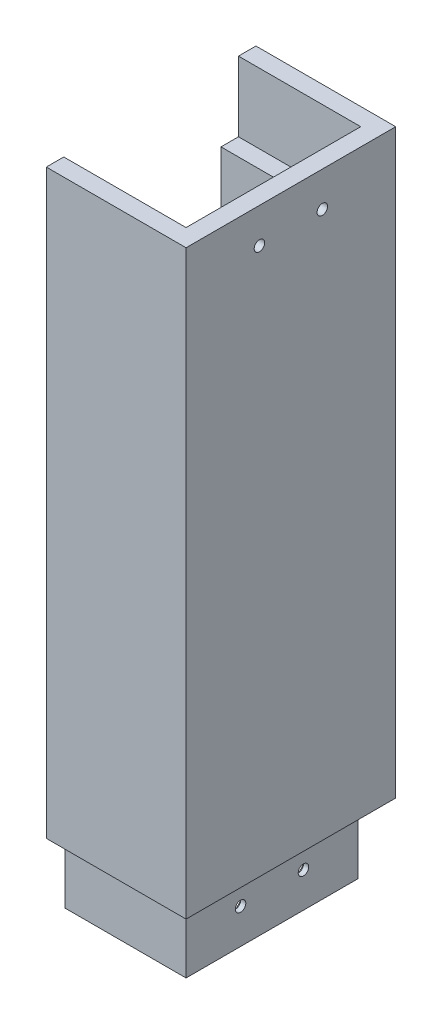
ISO-10303-21;
HEADER;
FILE_DESCRIPTION(('STEP AP214'),'2;1');
FILE_NAME('part.step','',(''),(''),'','','');
FILE_SCHEMA(('AUTOMOTIVE_DESIGN { 1 0 10303 214 1 1 1 1 }'));
ENDSEC;
DATA;
#1=APPLICATION_CONTEXT('core data for automotive mechanical design processes');
#2=APPLICATION_PROTOCOL_DEFINITION('international standard','automotive_design',2000,#1);
#3=PRODUCT_CONTEXT('',#1,'mechanical');
#4=PRODUCT('Part','Part','',(#3));
#5=PRODUCT_RELATED_PRODUCT_CATEGORY('part','',(#4));
#6=PRODUCT_DEFINITION_FORMATION('','',#4);
#7=PRODUCT_DEFINITION_CONTEXT('part definition',#1,'design');
#8=PRODUCT_DEFINITION('design','',#6,#7);
#9=PRODUCT_DEFINITION_SHAPE('','',#8);
#10=(LENGTH_UNIT() NAMED_UNIT(*) SI_UNIT(.MILLI.,.METRE.));
#11=(NAMED_UNIT(*) PLANE_ANGLE_UNIT() SI_UNIT($,.RADIAN.));
#12=(NAMED_UNIT(*) SI_UNIT($,.STERADIAN.) SOLID_ANGLE_UNIT());
#13=UNCERTAINTY_MEASURE_WITH_UNIT(LENGTH_MEASURE(1.E-05),#10,'distance_accuracy_value','');
#14=(GEOMETRIC_REPRESENTATION_CONTEXT(3) GLOBAL_UNCERTAINTY_ASSIGNED_CONTEXT((#13)) GLOBAL_UNIT_ASSIGNED_CONTEXT((#10,
#11,#12)) REPRESENTATION_CONTEXT('',''));
#15=CARTESIAN_POINT('',(0.,0.,0.));
#16=DIRECTION('',(0.,0.,1.));
#17=DIRECTION('',(1.,0.,0.));
#18=AXIS2_PLACEMENT_3D('',#15,#16,#17);
#19=CARTESIAN_POINT('',(-6.985,0.,14.48999986));
#20=DIRECTION('',(0.,-1.,0.));
#21=DIRECTION('',(0.,0.,-1.));
#22=AXIS2_PLACEMENT_3D('',#19,#20,#21);
#23=PLANE('',#22);
#24=DIRECTION('',(1.,0.,0.));
#25=VECTOR('',#24,1.);
#26=CARTESIAN_POINT('',(-3.175,0.,-13.45000014));
#27=LINE('',#26,#25);
#28=CARTESIAN_POINT('',(-25.4,0.,-13.45000014));
#29=VERTEX_POINT('',#28);
#30=CARTESIAN_POINT('',(-3.175,0.,-13.45000014));
#31=VERTEX_POINT('',#30);
#32=EDGE_CURVE('E188',#29,#31,#27,.T.);
#33=ORIENTED_EDGE('',*,*,#32,.F.);
#34=DIRECTION('',(0.,0.,1.));
#35=VECTOR('',#34,1.);
#36=CARTESIAN_POINT('',(-25.4,0.,-16.62500014));
#37=LINE('',#36,#35);
#38=CARTESIAN_POINT('',(-25.4,0.,-10.27500014));
#39=VERTEX_POINT('',#38);
#40=EDGE_CURVE('E241',#29,#39,#37,.T.);
#41=ORIENTED_EDGE('',*,*,#40,.T.);
#42=DIRECTION('',(1.,0.,0.));
#43=VECTOR('',#42,1.);
#44=CARTESIAN_POINT('',(-25.4,0.,-10.27500014));
#45=LINE('',#44,#43);
#46=CARTESIAN_POINT('',(-6.985,0.,-10.27500014));
#47=VERTEX_POINT('',#46);
#48=EDGE_CURVE('E243',#39,#47,#45,.T.);
#49=ORIENTED_EDGE('',*,*,#48,.T.);
#50=CARTESIAN_POINT('',(-6.985,0.,-9.64000013999999));
#51=DIRECTION('',(0.,-1.,0.));
#52=DIRECTION('',(0.,0.,1.));
#53=AXIS2_PLACEMENT_3D('',#50,#51,#52);
#54=CIRCLE('',#53,0.635000000000001);
#55=CARTESIAN_POINT('',(-6.35,0.,-9.64000013999999));
#56=VERTEX_POINT('',#55);
#57=EDGE_CURVE('E255',#47,#56,#54,.T.);
#58=ORIENTED_EDGE('',*,*,#57,.T.);
#59=DIRECTION('',(0.,0.,1.));
#60=VECTOR('',#59,1.);
#61=CARTESIAN_POINT('',(-6.35,0.,-9.64000013999999));
#62=LINE('',#61,#60);
#63=CARTESIAN_POINT('',(-6.35,0.,14.48999986));
#64=VERTEX_POINT('',#63);
#65=EDGE_CURVE('E260',#56,#64,#62,.T.);
#66=ORIENTED_EDGE('',*,*,#65,.T.);
#67=CARTESIAN_POINT('',(-6.985,0.,14.48999986));
#68=DIRECTION('',(0.,-1.,0.));
#69=DIRECTION('',(0.,0.,-1.));
#70=AXIS2_PLACEMENT_3D('',#67,#68,#69);
#71=CIRCLE('',#70,0.635000000000001);
#72=CARTESIAN_POINT('',(-6.985,0.,15.12499986));
#73=VERTEX_POINT('',#72);
#74=EDGE_CURVE('E265',#64,#73,#71,.T.);
#75=ORIENTED_EDGE('',*,*,#74,.T.);
#76=DIRECTION('',(-1.,0.,0.));
#77=VECTOR('',#76,1.);
#78=CARTESIAN_POINT('',(-25.4,0.,15.12499986));
#79=LINE('',#78,#77);
#80=CARTESIAN_POINT('',(-25.4,0.,15.12499986));
#81=VERTEX_POINT('',#80);
#82=EDGE_CURVE('E270',#73,#81,#79,.T.);
#83=ORIENTED_EDGE('',*,*,#82,.T.);
#84=DIRECTION('',(0.,0.,1.));
#85=VECTOR('',#84,1.);
#86=CARTESIAN_POINT('',(-25.4,0.,21.47499986));
#87=LINE('',#86,#85);
#88=CARTESIAN_POINT('',(-25.4,0.,18.29999986));
#89=VERTEX_POINT('',#88);
#90=EDGE_CURVE('E63',#81,#89,#87,.T.);
#91=ORIENTED_EDGE('',*,*,#90,.T.);
#92=DIRECTION('',(-1.,0.,0.));
#93=VECTOR('',#92,1.);
#94=CARTESIAN_POINT('',(-25.4,0.,18.29999986));
#95=LINE('',#94,#93);
#96=CARTESIAN_POINT('',(-3.175,0.,18.29999986));
#97=VERTEX_POINT('',#96);
#98=EDGE_CURVE('E185',#97,#89,#95,.T.);
#99=ORIENTED_EDGE('',*,*,#98,.F.);
#100=DIRECTION('',(0.,0.,1.));
#101=VECTOR('',#100,1.);
#102=CARTESIAN_POINT('',(-3.175,0.,18.29999986));
#103=LINE('',#102,#101);
#104=EDGE_CURVE('E57',#31,#97,#103,.T.);
#105=ORIENTED_EDGE('',*,*,#104,.F.);
#106=EDGE_LOOP('',(#33,#41,#49,#58,#66,#75,#83,#91,#99,#105));
#107=FACE_BOUND('',#106,.T.);
#108=ADVANCED_FACE('F41',(#107),#23,.F.);
#109=CARTESIAN_POINT('',(-6.98499999999999,-92.964,14.48999986));
#110=DIRECTION('',(0.,-1.,0.));
#111=DIRECTION('',(0.,0.,-1.));
#112=AXIS2_PLACEMENT_3D('',#109,#110,#111);
#113=PLANE('',#112);
#114=DIRECTION('',(-1.,0.,0.));
#115=VECTOR('',#114,1.);
#116=CARTESIAN_POINT('',(-25.4,-92.964,18.04599986));
#117=LINE('',#116,#115);
#118=CARTESIAN_POINT('',(-3.42899999999999,-92.964,18.04599986));
#119=VERTEX_POINT('',#118);
#120=CARTESIAN_POINT('',(-25.4,-92.964,18.04599986));
#121=VERTEX_POINT('',#120);
#122=EDGE_CURVE('E202',#119,#121,#117,.T.);
#123=ORIENTED_EDGE('',*,*,#122,.F.);
#124=DIRECTION('',(0.,0.,1.));
#125=VECTOR('',#124,1.);
#126=CARTESIAN_POINT('',(-3.42899999999999,-92.964,18.04599986));
#127=LINE('',#126,#125);
#128=CARTESIAN_POINT('',(-3.42899999999998,-92.964,-13.19600014));
#129=VERTEX_POINT('',#128);
#130=EDGE_CURVE('E192',#129,#119,#127,.T.);
#131=ORIENTED_EDGE('',*,*,#130,.F.);
#132=DIRECTION('',(1.,0.,0.));
#133=VECTOR('',#132,1.);
#134=CARTESIAN_POINT('',(-3.42899999999998,-92.964,-13.19600014));
#135=LINE('',#134,#133);
#136=CARTESIAN_POINT('',(-25.4,-92.964,-13.19600014));
#137=VERTEX_POINT('',#136);
#138=EDGE_CURVE('E189',#137,#129,#135,.T.);
#139=ORIENTED_EDGE('',*,*,#138,.F.);
#140=DIRECTION('',(0.,0.,1.));
#141=VECTOR('',#140,1.);
#142=CARTESIAN_POINT('',(-25.4,-92.964,-16.62500014));
#143=LINE('',#142,#141);
#144=CARTESIAN_POINT('',(-25.4,-92.964,-16.62500014));
#145=VERTEX_POINT('',#144);
#146=EDGE_CURVE('E244',#145,#137,#143,.T.);
#147=ORIENTED_EDGE('',*,*,#146,.F.);
#148=DIRECTION('',(-1.,0.,0.));
#149=VECTOR('',#148,1.);
#150=CARTESIAN_POINT('',(0.,-92.964,-16.62500014));
#151=LINE('',#150,#149);
#152=CARTESIAN_POINT('',(0.,-92.964,-16.62500014));
#153=VERTEX_POINT('',#152);
#154=EDGE_CURVE('E11',#153,#145,#151,.T.);
#155=ORIENTED_EDGE('',*,*,#154,.F.);
#156=DIRECTION('',(0.,0.,-1.));
#157=VECTOR('',#156,1.);
#158=CARTESIAN_POINT('',(0.,-92.964,-16.62500014));
#159=LINE('',#158,#157);
#160=CARTESIAN_POINT('',(0.,-92.964,21.47499986));
#161=VERTEX_POINT('',#160);
#162=EDGE_CURVE('E286',#161,#153,#159,.T.);
#163=ORIENTED_EDGE('',*,*,#162,.F.);
#164=DIRECTION('',(1.,0.,0.));
#165=VECTOR('',#164,1.);
#166=CARTESIAN_POINT('',(0.,-92.964,21.47499986));
#167=LINE('',#166,#165);
#168=CARTESIAN_POINT('',(-25.4,-92.964,21.47499986));
#169=VERTEX_POINT('',#168);
#170=EDGE_CURVE('E281',#169,#161,#167,.T.);
#171=ORIENTED_EDGE('',*,*,#170,.F.);
#172=DIRECTION('',(0.,0.,1.));
#173=VECTOR('',#172,1.);
#174=CARTESIAN_POINT('',(-25.4,-92.964,21.47499986));
#175=LINE('',#174,#173);
#176=EDGE_CURVE('E275',#121,#169,#175,.T.);
#177=ORIENTED_EDGE('',*,*,#176,.F.);
#178=EDGE_LOOP('',(#123,#131,#139,#147,#155,#163,#171,#177));
#179=FACE_BOUND('',#178,.T.);
#180=ADVANCED_FACE('F348',(#179),#113,.T.);
#181=CARTESIAN_POINT('',(-25.4,0.,-16.62500014));
#182=DIRECTION('',(1.,0.,0.));
#183=DIRECTION('',(0.,1.,0.));
#184=AXIS2_PLACEMENT_3D('',#181,#182,#183);
#185=PLANE('',#184);
#186=DIRECTION('',(0.,-1.,0.));
#187=VECTOR('',#186,1.);
#188=CARTESIAN_POINT('',(-25.4,0.,-10.27500014));
#189=LINE('',#188,#187);
#190=CARTESIAN_POINT('',(-25.4,-105.664,-10.27500014));
#191=VERTEX_POINT('',#190);
#192=EDGE_CURVE('E247',#39,#191,#189,.T.);
#193=ORIENTED_EDGE('',*,*,#192,.F.);
#194=ORIENTED_EDGE('',*,*,#40,.F.);
#195=DIRECTION('',(0.,-1.,0.));
#196=VECTOR('',#195,1.);
#197=CARTESIAN_POINT('',(-25.4,12.7,-13.45000014));
#198=LINE('',#197,#196);
#199=CARTESIAN_POINT('',(-25.4,12.7,-13.45000014));
#200=VERTEX_POINT('',#199);
#201=EDGE_CURVE('E335',#200,#29,#198,.T.);
#202=ORIENTED_EDGE('',*,*,#201,.F.);
#203=DIRECTION('',(0.,0.,1.));
#204=VECTOR('',#203,1.);
#205=CARTESIAN_POINT('',(-25.4,12.7,-13.45000014));
#206=LINE('',#205,#204);
#207=CARTESIAN_POINT('',(-25.4,12.7,-16.62500014));
#208=VERTEX_POINT('',#207);
#209=EDGE_CURVE('E181',#208,#200,#206,.T.);
#210=ORIENTED_EDGE('',*,*,#209,.F.);
#211=DIRECTION('',(0.,-1.,0.));
#212=VECTOR('',#211,1.);
#213=CARTESIAN_POINT('',(-25.4,0.,-16.62500014));
#214=LINE('',#213,#212);
#215=EDGE_CURVE('E248',#208,#145,#214,.T.);
#216=ORIENTED_EDGE('',*,*,#215,.T.);
#217=ORIENTED_EDGE('',*,*,#146,.T.);
#218=DIRECTION('',(0.,1.,0.));
#219=VECTOR('',#218,1.);
#220=CARTESIAN_POINT('',(-25.4,-105.664,-13.19600014));
#221=LINE('',#220,#219);
#222=CARTESIAN_POINT('',(-25.4,-105.664,-13.19600014));
#223=VERTEX_POINT('',#222);
#224=EDGE_CURVE('E238',#223,#137,#221,.T.);
#225=ORIENTED_EDGE('',*,*,#224,.F.);
#226=DIRECTION('',(0.,0.,-1.));
#227=VECTOR('',#226,1.);
#228=CARTESIAN_POINT('',(-25.4,-105.664,-13.19600014));
#229=LINE('',#228,#227);
#230=EDGE_CURVE('E217',#191,#223,#229,.T.);
#231=ORIENTED_EDGE('',*,*,#230,.F.);
#232=EDGE_LOOP('',(#193,#194,#202,#210,#216,#217,#225,#231));
#233=FACE_BOUND('',#232,.T.);
#234=ADVANCED_FACE('F355',(#233),#185,.F.);
#235=CARTESIAN_POINT('',(-25.4,0.,-10.27500014));
#236=DIRECTION('',(0.,0.,-1.));
#237=DIRECTION('',(-1.,0.,0.));
#238=AXIS2_PLACEMENT_3D('',#235,#236,#237);
#239=PLANE('',#238);
#240=DIRECTION('',(0.,-1.,0.));
#241=VECTOR('',#240,1.);
#242=CARTESIAN_POINT('',(-6.985,0.,-10.27500014));
#243=LINE('',#242,#241);
#244=CARTESIAN_POINT('',(-6.98499999999999,-105.664,-10.27500014));
#245=VERTEX_POINT('',#244);
#246=EDGE_CURVE('E250',#47,#245,#243,.T.);
#247=ORIENTED_EDGE('',*,*,#246,.F.);
#248=ORIENTED_EDGE('',*,*,#48,.F.);
#249=ORIENTED_EDGE('',*,*,#192,.T.);
#250=DIRECTION('',(-1.,0.,0.));
#251=VECTOR('',#250,1.);
#252=CARTESIAN_POINT('',(-25.4,-105.664,-10.27500014));
#253=LINE('',#252,#251);
#254=EDGE_CURVE('E214',#245,#191,#253,.T.);
#255=ORIENTED_EDGE('',*,*,#254,.F.);
#256=EDGE_LOOP('',(#247,#248,#249,#255));
#257=FACE_BOUND('',#256,.T.);
#258=ADVANCED_FACE('F394',(#257),#239,.F.);
#259=CARTESIAN_POINT('',(-6.985,0.,-9.64000013999999));
#260=DIRECTION('',(0.,-1.,0.));
#261=DIRECTION('',(1.,0.,0.));
#262=AXIS2_PLACEMENT_3D('',#259,#260,#261);
#263=CYLINDRICAL_SURFACE('',#262,0.635000000000001);
#264=DIRECTION('',(0.,-1.,0.));
#265=VECTOR('',#264,1.);
#266=CARTESIAN_POINT('',(-6.35,0.,-9.64000013999999));
#267=LINE('',#266,#265);
#268=CARTESIAN_POINT('',(-6.34999999999999,-105.664,-9.64000013999999));
#269=VERTEX_POINT('',#268);
#270=EDGE_CURVE('E257',#56,#269,#267,.T.);
#271=ORIENTED_EDGE('',*,*,#270,.F.);
#272=ORIENTED_EDGE('',*,*,#57,.F.);
#273=ORIENTED_EDGE('',*,*,#246,.T.);
#274=CARTESIAN_POINT('',(-6.985,-105.664,-9.64000013999999));
#275=DIRECTION('',(0.,1.,0.));
#276=DIRECTION('',(0.,0.,-1.));
#277=AXIS2_PLACEMENT_3D('',#274,#275,#276);
#278=CIRCLE('',#277,0.635000000000008);
#279=EDGE_CURVE('E211',#269,#245,#278,.T.);
#280=ORIENTED_EDGE('',*,*,#279,.F.);
#281=EDGE_LOOP('',(#271,#272,#273,#280));
#282=FACE_BOUND('',#281,.T.);
#283=ADVANCED_FACE('F390',(#282),#263,.F.);
#284=CARTESIAN_POINT('',(-6.35,0.,-9.64000013999999));
#285=DIRECTION('',(1.,0.,0.));
#286=DIRECTION('',(0.,1.,0.));
#287=AXIS2_PLACEMENT_3D('',#284,#285,#286);
#288=PLANE('',#287);
#289=CARTESIAN_POINT('',(-6.34999999999999,-99.314,-3.29000014));
#290=DIRECTION('',(-1.,0.,0.));
#291=DIRECTION('',(0.,0.,1.));
#292=AXIS2_PLACEMENT_3D('',#289,#290,#291);
#293=CIRCLE('',#292,3.5433);
#294=CARTESIAN_POINT('',(-6.34999999999999,-99.314,0.253299860000004));
#295=VERTEX_POINT('',#294);
#296=EDGE_CURVE('E464',#295,#295,#293,.T.);
#297=ORIENTED_EDGE('',*,*,#296,.F.);
#298=EDGE_LOOP('',(#297));
#299=FACE_BOUND('',#298,.T.);
#300=CARTESIAN_POINT('',(-6.34999999999999,-99.314,8.13999986));
#301=DIRECTION('',(-1.,0.,0.));
#302=DIRECTION('',(0.,0.,1.));
#303=AXIS2_PLACEMENT_3D('',#300,#301,#302);
#304=CIRCLE('',#303,3.5433);
#305=CARTESIAN_POINT('',(-6.34999999999999,-99.314,11.68329986));
#306=VERTEX_POINT('',#305);
#307=EDGE_CURVE('E307',#306,#306,#304,.T.);
#308=ORIENTED_EDGE('',*,*,#307,.F.);
#309=EDGE_LOOP('',(#308));
#310=FACE_BOUND('',#309,.T.);
#311=DIRECTION('',(0.,-1.,0.));
#312=VECTOR('',#311,1.);
#313=CARTESIAN_POINT('',(-6.35,0.,14.48999986));
#314=LINE('',#313,#312);
#315=CARTESIAN_POINT('',(-6.34999999999999,-105.664,14.48999986));
#316=VERTEX_POINT('',#315);
#317=EDGE_CURVE('E262',#64,#316,#314,.T.);
#318=ORIENTED_EDGE('',*,*,#317,.F.);
#319=ORIENTED_EDGE('',*,*,#65,.F.);
#320=ORIENTED_EDGE('',*,*,#270,.T.);
#321=DIRECTION('',(0.,0.,-1.));
#322=VECTOR('',#321,1.);
#323=CARTESIAN_POINT('',(-6.34999999999999,-105.664,14.48999986));
#324=LINE('',#323,#322);
#325=EDGE_CURVE('E208',#316,#269,#324,.T.);
#326=ORIENTED_EDGE('',*,*,#325,.F.);
#327=EDGE_LOOP('',(#318,#319,#320,#326));
#328=FACE_BOUND('',#327,.T.);
#329=ADVANCED_FACE('F386',(#299,#310,#328),#288,.F.);
#330=CARTESIAN_POINT('',(-6.985,0.,14.48999986));
#331=DIRECTION('',(0.,-1.,0.));
#332=DIRECTION('',(1.,0.,0.));
#333=AXIS2_PLACEMENT_3D('',#330,#331,#332);
#334=CYLINDRICAL_SURFACE('',#333,0.635000000000001);
#335=DIRECTION('',(0.,-1.,0.));
#336=VECTOR('',#335,1.);
#337=CARTESIAN_POINT('',(-6.985,0.,15.12499986));
#338=LINE('',#337,#336);
#339=CARTESIAN_POINT('',(-6.98499999999999,-105.664,15.12499986));
#340=VERTEX_POINT('',#339);
#341=EDGE_CURVE('E267',#73,#340,#338,.T.);
#342=ORIENTED_EDGE('',*,*,#341,.F.);
#343=ORIENTED_EDGE('',*,*,#74,.F.);
#344=ORIENTED_EDGE('',*,*,#317,.T.);
#345=CARTESIAN_POINT('',(-6.985,-105.664,14.48999986));
#346=DIRECTION('',(0.,1.,0.));
#347=DIRECTION('',(0.,0.,1.));
#348=AXIS2_PLACEMENT_3D('',#345,#346,#347);
#349=CIRCLE('',#348,0.635000000000007);
#350=EDGE_CURVE('E205',#340,#316,#349,.T.);
#351=ORIENTED_EDGE('',*,*,#350,.F.);
#352=EDGE_LOOP('',(#342,#343,#344,#351));
#353=FACE_BOUND('',#352,.T.);
#354=ADVANCED_FACE('F382',(#353),#334,.F.);
#355=CARTESIAN_POINT('',(-25.4,0.,15.12499986));
#356=DIRECTION('',(0.,0.,1.));
#357=DIRECTION('',(1.,0.,0.));
#358=AXIS2_PLACEMENT_3D('',#355,#356,#357);
#359=PLANE('',#358);
#360=DIRECTION('',(0.,-1.,0.));
#361=VECTOR('',#360,1.);
#362=CARTESIAN_POINT('',(-25.4,0.,15.12499986));
#363=LINE('',#362,#361);
#364=CARTESIAN_POINT('',(-25.4,-105.664,15.12499986));
#365=VERTEX_POINT('',#364);
#366=EDGE_CURVE('E272',#81,#365,#363,.T.);
#367=ORIENTED_EDGE('',*,*,#366,.F.);
#368=ORIENTED_EDGE('',*,*,#82,.F.);
#369=ORIENTED_EDGE('',*,*,#341,.T.);
#370=DIRECTION('',(1.,0.,0.));
#371=VECTOR('',#370,1.);
#372=CARTESIAN_POINT('',(-25.4,-105.664,15.12499986));
#373=LINE('',#372,#371);
#374=EDGE_CURVE('E201',#365,#340,#373,.T.);
#375=ORIENTED_EDGE('',*,*,#374,.F.);
#376=EDGE_LOOP('',(#367,#368,#369,#375));
#377=FACE_BOUND('',#376,.T.);
#378=ADVANCED_FACE('F379',(#377),#359,.F.);
#379=CARTESIAN_POINT('',(-25.4,0.,21.47499986));
#380=DIRECTION('',(1.,0.,0.));
#381=DIRECTION('',(0.,1.,0.));
#382=AXIS2_PLACEMENT_3D('',#379,#380,#381);
#383=PLANE('',#382);
#384=DIRECTION('',(0.,-1.,0.));
#385=VECTOR('',#384,1.);
#386=CARTESIAN_POINT('',(-25.4,0.,21.47499986));
#387=LINE('',#386,#385);
#388=CARTESIAN_POINT('',(-25.4,12.7,21.47499986));
#389=VERTEX_POINT('',#388);
#390=EDGE_CURVE('E278',#389,#169,#387,.T.);
#391=ORIENTED_EDGE('',*,*,#390,.F.);
#392=DIRECTION('',(0.,0.,1.));
#393=VECTOR('',#392,1.);
#394=CARTESIAN_POINT('',(-25.4,12.7,21.47499986));
#395=LINE('',#394,#393);
#396=CARTESIAN_POINT('',(-25.4,12.7,18.29999986));
#397=VERTEX_POINT('',#396);
#398=EDGE_CURVE('E323',#397,#389,#395,.T.);
#399=ORIENTED_EDGE('',*,*,#398,.F.);
#400=DIRECTION('',(0.,-1.,0.));
#401=VECTOR('',#400,1.);
#402=CARTESIAN_POINT('',(-25.4,12.7,18.29999986));
#403=LINE('',#402,#401);
#404=EDGE_CURVE('E194',#397,#89,#403,.T.);
#405=ORIENTED_EDGE('',*,*,#404,.T.);
#406=ORIENTED_EDGE('',*,*,#90,.F.);
#407=ORIENTED_EDGE('',*,*,#366,.T.);
#408=DIRECTION('',(0.,0.,-1.));
#409=VECTOR('',#408,1.);
#410=CARTESIAN_POINT('',(-25.4,-105.664,18.04599986));
#411=LINE('',#410,#409);
#412=CARTESIAN_POINT('',(-25.4,-105.664,18.04599986));
#413=VERTEX_POINT('',#412);
#414=EDGE_CURVE('E198',#413,#365,#411,.T.);
#415=ORIENTED_EDGE('',*,*,#414,.F.);
#416=DIRECTION('',(0.,1.,0.));
#417=VECTOR('',#416,1.);
#418=CARTESIAN_POINT('',(-25.4,-105.664,18.04599986));
#419=LINE('',#418,#417);
#420=EDGE_CURVE('E224',#413,#121,#419,.T.);
#421=ORIENTED_EDGE('',*,*,#420,.T.);
#422=ORIENTED_EDGE('',*,*,#176,.T.);
#423=EDGE_LOOP('',(#391,#399,#405,#406,#407,#415,#421,#422));
#424=FACE_BOUND('',#423,.T.);
#425=ADVANCED_FACE('F343',(#424),#383,.F.);
#426=CARTESIAN_POINT('',(0.,0.,21.47499986));
#427=DIRECTION('',(0.,0.,-1.));
#428=DIRECTION('',(-1.,0.,0.));
#429=AXIS2_PLACEMENT_3D('',#426,#427,#428);
#430=PLANE('',#429);
#431=DIRECTION('',(0.,-1.,0.));
#432=VECTOR('',#431,1.);
#433=CARTESIAN_POINT('',(0.,0.,21.47499986));
#434=LINE('',#433,#432);
#435=CARTESIAN_POINT('',(0.,12.7,21.47499986));
#436=VERTEX_POINT('',#435);
#437=EDGE_CURVE('E283',#436,#161,#434,.T.);
#438=ORIENTED_EDGE('',*,*,#437,.F.);
#439=DIRECTION('',(1.,0.,0.));
#440=VECTOR('',#439,1.);
#441=CARTESIAN_POINT('',(0.,12.7,21.47499986));
#442=LINE('',#441,#440);
#443=EDGE_CURVE('E326',#389,#436,#442,.T.);
#444=ORIENTED_EDGE('',*,*,#443,.F.);
#445=ORIENTED_EDGE('',*,*,#390,.T.);
#446=ORIENTED_EDGE('',*,*,#170,.T.);
#447=EDGE_LOOP('',(#438,#444,#445,#446));
#448=FACE_BOUND('',#447,.T.);
#449=ADVANCED_FACE('F371',(#448),#430,.F.);
#450=CARTESIAN_POINT('',(0.,0.,-16.62500014));
#451=DIRECTION('',(-1.,0.,0.));
#452=DIRECTION('',(0.,-1.,0.));
#453=AXIS2_PLACEMENT_3D('',#450,#451,#452);
#454=PLANE('',#453);
#455=CARTESIAN_POINT('',(0.,6.35,-3.29000014));
#456=DIRECTION('',(-1.,0.,0.));
#457=DIRECTION('',(0.,0.,1.));
#458=AXIS2_PLACEMENT_3D('',#455,#456,#457);
#459=CIRCLE('',#458,0.9525);
#460=CARTESIAN_POINT('',(0.,6.35,-2.33750014));
#461=VERTEX_POINT('',#460);
#462=EDGE_CURVE('E311',#461,#461,#459,.T.);
#463=ORIENTED_EDGE('',*,*,#462,.T.);
#464=EDGE_LOOP('',(#463));
#465=FACE_BOUND('',#464,.T.);
#466=CARTESIAN_POINT('',(0.,6.35,8.13999986));
#467=DIRECTION('',(-1.,0.,0.));
#468=DIRECTION('',(0.,0.,1.));
#469=AXIS2_PLACEMENT_3D('',#466,#467,#468);
#470=CIRCLE('',#469,0.9525);
#471=CARTESIAN_POINT('',(0.,6.35,9.09249986));
#472=VERTEX_POINT('',#471);
#473=EDGE_CURVE('E296',#472,#472,#470,.T.);
#474=ORIENTED_EDGE('',*,*,#473,.T.);
#475=EDGE_LOOP('',(#474));
#476=FACE_BOUND('',#475,.T.);
#477=DIRECTION('',(0.,-1.,0.));
#478=VECTOR('',#477,1.);
#479=CARTESIAN_POINT('',(0.,0.,-16.62500014));
#480=LINE('',#479,#478);
#481=CARTESIAN_POINT('',(0.,12.7,-16.62500014));
#482=VERTEX_POINT('',#481);
#483=EDGE_CURVE('E49',#482,#153,#480,.T.);
#484=ORIENTED_EDGE('',*,*,#483,.F.);
#485=DIRECTION('',(0.,0.,-1.));
#486=VECTOR('',#485,1.);
#487=CARTESIAN_POINT('',(0.,12.7,-16.62500014));
#488=LINE('',#487,#486);
#489=EDGE_CURVE('E329',#436,#482,#488,.T.);
#490=ORIENTED_EDGE('',*,*,#489,.F.);
#491=ORIENTED_EDGE('',*,*,#437,.T.);
#492=ORIENTED_EDGE('',*,*,#162,.T.);
#493=EDGE_LOOP('',(#484,#490,#491,#492));
#494=FACE_BOUND('',#493,.T.);
#495=ADVANCED_FACE('F359',(#465,#476,#494),#454,.F.);
#496=CARTESIAN_POINT('',(0.,0.,-16.62500014));
#497=DIRECTION('',(0.,0.,1.));
#498=DIRECTION('',(1.,0.,0.));
#499=AXIS2_PLACEMENT_3D('',#496,#497,#498);
#500=PLANE('',#499);
#501=ORIENTED_EDGE('',*,*,#154,.T.);
#502=ORIENTED_EDGE('',*,*,#215,.F.);
#503=DIRECTION('',(-1.,0.,0.));
#504=VECTOR('',#503,1.);
#505=CARTESIAN_POINT('',(-25.4,12.7,-16.62500014));
#506=LINE('',#505,#504);
#507=EDGE_CURVE('E332',#482,#208,#506,.T.);
#508=ORIENTED_EDGE('',*,*,#507,.F.);
#509=ORIENTED_EDGE('',*,*,#483,.T.);
#510=EDGE_LOOP('',(#501,#502,#508,#509));
#511=FACE_BOUND('',#510,.T.);
#512=ADVANCED_FACE('F349',(#511),#500,.F.);
#513=CARTESIAN_POINT('',(-3.42899999999998,-105.664,-13.19600014));
#514=DIRECTION('',(0.,0.,1.));
#515=DIRECTION('',(1.,0.,0.));
#516=AXIS2_PLACEMENT_3D('',#513,#514,#515);
#517=PLANE('',#516);
#518=ORIENTED_EDGE('',*,*,#138,.T.);
#519=DIRECTION('',(0.,1.,0.));
#520=VECTOR('',#519,1.);
#521=CARTESIAN_POINT('',(-3.42899999999998,-105.664,-13.19600014));
#522=LINE('',#521,#520);
#523=CARTESIAN_POINT('',(-3.42899999999998,-105.664,-13.19600014));
#524=VERTEX_POINT('',#523);
#525=EDGE_CURVE('E235',#524,#129,#522,.T.);
#526=ORIENTED_EDGE('',*,*,#525,.F.);
#527=DIRECTION('',(1.,0.,0.));
#528=VECTOR('',#527,1.);
#529=CARTESIAN_POINT('',(-3.42899999999998,-105.664,-13.19600014));
#530=LINE('',#529,#528);
#531=EDGE_CURVE('E219',#223,#524,#530,.T.);
#532=ORIENTED_EDGE('',*,*,#531,.F.);
#533=ORIENTED_EDGE('',*,*,#224,.T.);
#534=EDGE_LOOP('',(#518,#526,#532,#533));
#535=FACE_BOUND('',#534,.T.);
#536=ADVANCED_FACE('F357',(#535),#517,.F.);
#537=CARTESIAN_POINT('',(-3.42899999999999,-105.664,18.04599986));
#538=DIRECTION('',(-1.,0.,0.));
#539=DIRECTION('',(0.,0.,1.));
#540=AXIS2_PLACEMENT_3D('',#537,#538,#539);
#541=PLANE('',#540);
#542=CARTESIAN_POINT('',(-3.42899999999998,-99.314,-3.29000014));
#543=DIRECTION('',(-1.,0.,0.));
#544=DIRECTION('',(0.,0.,1.));
#545=AXIS2_PLACEMENT_3D('',#542,#543,#544);
#546=CIRCLE('',#545,0.952499999999995);
#547=CARTESIAN_POINT('',(-3.42899999999998,-99.314,-2.33750014));
#548=VERTEX_POINT('',#547);
#549=EDGE_CURVE('E293',#548,#548,#546,.T.);
#550=ORIENTED_EDGE('',*,*,#549,.T.);
#551=EDGE_LOOP('',(#550));
#552=FACE_BOUND('',#551,.T.);
#553=CARTESIAN_POINT('',(-3.42899999999998,-99.314,8.13999986));
#554=DIRECTION('',(-1.,0.,0.));
#555=DIRECTION('',(0.,0.,1.));
#556=AXIS2_PLACEMENT_3D('',#553,#554,#555);
#557=CIRCLE('',#556,0.952499999999992);
#558=CARTESIAN_POINT('',(-3.42899999999998,-99.314,9.09249985999999));
#559=VERTEX_POINT('',#558);
#560=EDGE_CURVE('E290',#559,#559,#557,.T.);
#561=ORIENTED_EDGE('',*,*,#560,.T.);
#562=EDGE_LOOP('',(#561));
#563=FACE_BOUND('',#562,.T.);
#564=ORIENTED_EDGE('',*,*,#130,.T.);
#565=DIRECTION('',(0.,1.,0.));
#566=VECTOR('',#565,1.);
#567=CARTESIAN_POINT('',(-3.42899999999999,-105.664,18.04599986));
#568=LINE('',#567,#566);
#569=CARTESIAN_POINT('',(-3.42899999999999,-105.664,18.04599986));
#570=VERTEX_POINT('',#569);
#571=EDGE_CURVE('E232',#570,#119,#568,.T.);
#572=ORIENTED_EDGE('',*,*,#571,.F.);
#573=DIRECTION('',(0.,0.,1.));
#574=VECTOR('',#573,1.);
#575=CARTESIAN_POINT('',(-3.42899999999999,-105.664,18.04599986));
#576=LINE('',#575,#574);
#577=EDGE_CURVE('E221',#524,#570,#576,.T.);
#578=ORIENTED_EDGE('',*,*,#577,.F.);
#579=ORIENTED_EDGE('',*,*,#525,.T.);
#580=EDGE_LOOP('',(#564,#572,#578,#579));
#581=FACE_BOUND('',#580,.T.);
#582=ADVANCED_FACE('F367',(#552,#563,#581),#541,.F.);
#583=CARTESIAN_POINT('',(-25.4,-105.664,18.04599986));
#584=DIRECTION('',(0.,0.,-1.));
#585=DIRECTION('',(-1.,0.,0.));
#586=AXIS2_PLACEMENT_3D('',#583,#584,#585);
#587=PLANE('',#586);
#588=ORIENTED_EDGE('',*,*,#122,.T.);
#589=ORIENTED_EDGE('',*,*,#420,.F.);
#590=DIRECTION('',(-1.,0.,0.));
#591=VECTOR('',#590,1.);
#592=CARTESIAN_POINT('',(-25.4,-105.664,18.04599986));
#593=LINE('',#592,#591);
#594=EDGE_CURVE('E223',#570,#413,#593,.T.);
#595=ORIENTED_EDGE('',*,*,#594,.F.);
#596=ORIENTED_EDGE('',*,*,#571,.T.);
#597=EDGE_LOOP('',(#588,#589,#595,#596));
#598=FACE_BOUND('',#597,.T.);
#599=ADVANCED_FACE('F403',(#598),#587,.F.);
#600=CARTESIAN_POINT('',(-6.985,-105.664,14.48999986));
#601=DIRECTION('',(0.,1.,0.));
#602=DIRECTION('',(0.,0.,1.));
#603=AXIS2_PLACEMENT_3D('',#600,#601,#602);
#604=PLANE('',#603);
#605=ORIENTED_EDGE('',*,*,#414,.T.);
#606=ORIENTED_EDGE('',*,*,#374,.T.);
#607=ORIENTED_EDGE('',*,*,#350,.T.);
#608=ORIENTED_EDGE('',*,*,#325,.T.);
#609=ORIENTED_EDGE('',*,*,#279,.T.);
#610=ORIENTED_EDGE('',*,*,#254,.T.);
#611=ORIENTED_EDGE('',*,*,#230,.T.);
#612=ORIENTED_EDGE('',*,*,#531,.T.);
#613=ORIENTED_EDGE('',*,*,#577,.T.);
#614=ORIENTED_EDGE('',*,*,#594,.T.);
#615=EDGE_LOOP('',(#605,#606,#607,#608,#609,#610,#611,#612,#613,#614));
#616=FACE_BOUND('',#615,.T.);
#617=ADVANCED_FACE('F407',(#616),#604,.F.);
#618=CARTESIAN_POINT('',(-3.175,12.7,-13.45000014));
#619=DIRECTION('',(0.,0.,-1.));
#620=DIRECTION('',(-1.,0.,0.));
#621=AXIS2_PLACEMENT_3D('',#618,#619,#620);
#622=PLANE('',#621);
#623=ORIENTED_EDGE('',*,*,#32,.T.);
#624=DIRECTION('',(0.,-1.,0.));
#625=VECTOR('',#624,1.);
#626=CARTESIAN_POINT('',(-3.175,12.7,-13.45000014));
#627=LINE('',#626,#625);
#628=CARTESIAN_POINT('',(-3.175,12.7,-13.45000014));
#629=VERTEX_POINT('',#628);
#630=EDGE_CURVE('E168',#629,#31,#627,.T.);
#631=ORIENTED_EDGE('',*,*,#630,.F.);
#632=DIRECTION('',(1.,0.,0.));
#633=VECTOR('',#632,1.);
#634=CARTESIAN_POINT('',(-3.175,12.7,-13.45000014));
#635=LINE('',#634,#633);
#636=EDGE_CURVE('E175',#200,#629,#635,.T.);
#637=ORIENTED_EDGE('',*,*,#636,.F.);
#638=ORIENTED_EDGE('',*,*,#201,.T.);
#639=EDGE_LOOP('',(#623,#631,#637,#638));
#640=FACE_BOUND('',#639,.T.);
#641=ADVANCED_FACE('F187',(#640),#622,.F.);
#642=CARTESIAN_POINT('',(-3.175,12.7,18.29999986));
#643=DIRECTION('',(1.,0.,0.));
#644=DIRECTION('',(0.,0.,-1.));
#645=AXIS2_PLACEMENT_3D('',#642,#643,#644);
#646=PLANE('',#645);
#647=CARTESIAN_POINT('',(-3.175,6.35,-3.29000014));
#648=DIRECTION('',(-1.,0.,0.));
#649=DIRECTION('',(0.,0.,1.));
#650=AXIS2_PLACEMENT_3D('',#647,#648,#649);
#651=CIRCLE('',#650,0.9525);
#652=CARTESIAN_POINT('',(-3.175,6.35,-2.33750014));
#653=VERTEX_POINT('',#652);
#654=EDGE_CURVE('E314',#653,#653,#651,.T.);
#655=ORIENTED_EDGE('',*,*,#654,.F.);
#656=EDGE_LOOP('',(#655));
#657=FACE_BOUND('',#656,.T.);
#658=CARTESIAN_POINT('',(-3.175,6.35,8.13999986));
#659=DIRECTION('',(-1.,0.,0.));
#660=DIRECTION('',(0.,0.,1.));
#661=AXIS2_PLACEMENT_3D('',#658,#659,#660);
#662=CIRCLE('',#661,0.9525);
#663=CARTESIAN_POINT('',(-3.175,6.35,9.09249986));
#664=VERTEX_POINT('',#663);
#665=EDGE_CURVE('E317',#664,#664,#662,.T.);
#666=ORIENTED_EDGE('',*,*,#665,.F.);
#667=EDGE_LOOP('',(#666));
#668=FACE_BOUND('',#667,.T.);
#669=ORIENTED_EDGE('',*,*,#104,.T.);
#670=DIRECTION('',(0.,-1.,0.));
#671=VECTOR('',#670,1.);
#672=CARTESIAN_POINT('',(-3.175,12.7,18.29999986));
#673=LINE('',#672,#671);
#674=CARTESIAN_POINT('',(-3.175,12.7,18.29999986));
#675=VERTEX_POINT('',#674);
#676=EDGE_CURVE('E171',#675,#97,#673,.T.);
#677=ORIENTED_EDGE('',*,*,#676,.F.);
#678=DIRECTION('',(0.,0.,1.));
#679=VECTOR('',#678,1.);
#680=CARTESIAN_POINT('',(-3.175,12.7,18.29999986));
#681=LINE('',#680,#679);
#682=EDGE_CURVE('E164',#629,#675,#681,.T.);
#683=ORIENTED_EDGE('',*,*,#682,.F.);
#684=ORIENTED_EDGE('',*,*,#630,.T.);
#685=EDGE_LOOP('',(#669,#677,#683,#684));
#686=FACE_BOUND('',#685,.T.);
#687=ADVANCED_FACE('F166',(#657,#668,#686),#646,.F.);
#688=CARTESIAN_POINT('',(-25.4,12.7,18.29999986));
#689=DIRECTION('',(0.,0.,1.));
#690=DIRECTION('',(1.,0.,0.));
#691=AXIS2_PLACEMENT_3D('',#688,#689,#690);
#692=PLANE('',#691);
#693=ORIENTED_EDGE('',*,*,#98,.T.);
#694=ORIENTED_EDGE('',*,*,#404,.F.);
#695=DIRECTION('',(-1.,0.,0.));
#696=VECTOR('',#695,1.);
#697=CARTESIAN_POINT('',(-25.4,12.7,18.29999986));
#698=LINE('',#697,#696);
#699=EDGE_CURVE('E174',#675,#397,#698,.T.);
#700=ORIENTED_EDGE('',*,*,#699,.F.);
#701=ORIENTED_EDGE('',*,*,#676,.T.);
#702=EDGE_LOOP('',(#693,#694,#700,#701));
#703=FACE_BOUND('',#702,.T.);
#704=ADVANCED_FACE('F345',(#703),#692,.F.);
#705=CARTESIAN_POINT('',(0.,12.7,0.));
#706=DIRECTION('',(0.,-1.,0.));
#707=DIRECTION('',(0.,0.,-1.));
#708=AXIS2_PLACEMENT_3D('',#705,#706,#707);
#709=PLANE('',#708);
#710=ORIENTED_EDGE('',*,*,#636,.T.);
#711=ORIENTED_EDGE('',*,*,#682,.T.);
#712=ORIENTED_EDGE('',*,*,#699,.T.);
#713=ORIENTED_EDGE('',*,*,#398,.T.);
#714=ORIENTED_EDGE('',*,*,#443,.T.);
#715=ORIENTED_EDGE('',*,*,#489,.T.);
#716=ORIENTED_EDGE('',*,*,#507,.T.);
#717=ORIENTED_EDGE('',*,*,#209,.T.);
#718=EDGE_LOOP('',(#710,#711,#712,#713,#714,#715,#716,#717));
#719=FACE_BOUND('',#718,.T.);
#720=ADVANCED_FACE('F178',(#719),#709,.F.);
#721=CARTESIAN_POINT('',(0.,6.35,8.13999986));
#722=DIRECTION('',(-1.,0.,0.));
#723=DIRECTION('',(0.,0.,1.));
#724=AXIS2_PLACEMENT_3D('',#721,#722,#723);
#725=CYLINDRICAL_SURFACE('',#724,0.9525);
#726=ORIENTED_EDGE('',*,*,#473,.F.);
#727=EDGE_LOOP('',(#726));
#728=FACE_BOUND('',#727,.T.);
#729=ORIENTED_EDGE('',*,*,#665,.T.);
#730=EDGE_LOOP('',(#729));
#731=FACE_BOUND('',#730,.T.);
#732=ADVANCED_FACE('F419',(#728,#731),#725,.F.);
#733=CARTESIAN_POINT('',(0.,6.35,-3.29000014));
#734=DIRECTION('',(-1.,0.,0.));
#735=DIRECTION('',(0.,0.,1.));
#736=AXIS2_PLACEMENT_3D('',#733,#734,#735);
#737=CYLINDRICAL_SURFACE('',#736,0.9525);
#738=ORIENTED_EDGE('',*,*,#462,.F.);
#739=EDGE_LOOP('',(#738));
#740=FACE_BOUND('',#739,.T.);
#741=ORIENTED_EDGE('',*,*,#654,.T.);
#742=EDGE_LOOP('',(#741));
#743=FACE_BOUND('',#742,.T.);
#744=ADVANCED_FACE('F422',(#740,#743),#737,.F.);
#745=CARTESIAN_POINT('',(0.,-99.314,8.13999986));
#746=DIRECTION('',(-1.,0.,0.));
#747=DIRECTION('',(0.,0.,1.));
#748=AXIS2_PLACEMENT_3D('',#745,#746,#747);
#749=CYLINDRICAL_SURFACE('',#748,0.952499999999992);
#750=CARTESIAN_POINT('',(-4.35887712807406,-99.314,8.13999986));
#751=DIRECTION('',(-1.,0.,0.));
#752=DIRECTION('',(0.,0.,1.));
#753=AXIS2_PLACEMENT_3D('',#750,#751,#752);
#754=CIRCLE('',#753,0.952499999999992);
#755=CARTESIAN_POINT('',(-4.35887712807406,-99.314,9.09249985999999));
#756=VERTEX_POINT('',#755);
#757=EDGE_CURVE('E294',#756,#756,#754,.T.);
#758=ORIENTED_EDGE('',*,*,#757,.T.);
#759=EDGE_LOOP('',(#758));
#760=FACE_BOUND('',#759,.T.);
#761=ORIENTED_EDGE('',*,*,#560,.F.);
#762=EDGE_LOOP('',(#761));
#763=FACE_BOUND('',#762,.T.);
#764=ADVANCED_FACE('F426',(#760,#763),#749,.F.);
#765=CARTESIAN_POINT('',(0.,-99.314,-3.29000014));
#766=DIRECTION('',(-1.,0.,0.));
#767=DIRECTION('',(0.,0.,1.));
#768=AXIS2_PLACEMENT_3D('',#765,#766,#767);
#769=CYLINDRICAL_SURFACE('',#768,0.952499999999995);
#770=CARTESIAN_POINT('',(-4.35887712807406,-99.314,-3.29000014));
#771=DIRECTION('',(-1.,0.,0.));
#772=DIRECTION('',(0.,0.,1.));
#773=AXIS2_PLACEMENT_3D('',#770,#771,#772);
#774=CIRCLE('',#773,0.952499999999995);
#775=CARTESIAN_POINT('',(-4.35887712807406,-99.314,-2.33750014));
#776=VERTEX_POINT('',#775);
#777=EDGE_CURVE('E44',#776,#776,#774,.T.);
#778=ORIENTED_EDGE('',*,*,#777,.T.);
#779=EDGE_LOOP('',(#778));
#780=FACE_BOUND('',#779,.T.);
#781=ORIENTED_EDGE('',*,*,#549,.F.);
#782=EDGE_LOOP('',(#781));
#783=FACE_BOUND('',#782,.T.);
#784=ADVANCED_FACE('F430',(#780,#783),#769,.F.);
#785=CARTESIAN_POINT('',(-5.07999999999999,-99.314,8.13999986));
#786=DIRECTION('',(-1.,0.,0.));
#787=DIRECTION('',(0.,0.,1.));
#788=AXIS2_PLACEMENT_3D('',#785,#786,#787);
#789=CONICAL_SURFACE('',#788,2.15264999999999,1.02974425867665);
#790=CARTESIAN_POINT('',(-5.07999999999999,-99.314,8.13999986));
#791=DIRECTION('',(-1.,0.,0.));
#792=DIRECTION('',(0.,0.,1.));
#793=AXIS2_PLACEMENT_3D('',#790,#791,#792);
#794=CIRCLE('',#793,2.15264999999999);
#795=CARTESIAN_POINT('',(-5.07999999999999,-99.314,10.29264986));
#796=VERTEX_POINT('',#795);
#797=EDGE_CURVE('E298',#796,#796,#794,.T.);
#798=ORIENTED_EDGE('',*,*,#797,.T.);
#799=EDGE_LOOP('',(#798));
#800=FACE_BOUND('',#799,.T.);
#801=ORIENTED_EDGE('',*,*,#757,.F.);
#802=EDGE_LOOP('',(#801));
#803=FACE_BOUND('',#802,.T.);
#804=ADVANCED_FACE('F433',(#800,#803),#789,.F.);
#805=CARTESIAN_POINT('',(-6.34999999999999,-99.314,8.13999986));
#806=DIRECTION('',(-1.,0.,0.));
#807=DIRECTION('',(0.,0.,1.));
#808=AXIS2_PLACEMENT_3D('',#805,#806,#807);
#809=CYLINDRICAL_SURFACE('',#808,2.15264999999999);
#810=ORIENTED_EDGE('',*,*,#797,.F.);
#811=EDGE_LOOP('',(#810));
#812=FACE_BOUND('',#811,.T.);
#813=CARTESIAN_POINT('',(-5.18310609790331,-99.314,8.13999986));
#814=DIRECTION('',(-1.,0.,0.));
#815=DIRECTION('',(0.,0.,1.));
#816=AXIS2_PLACEMENT_3D('',#813,#814,#815);
#817=CIRCLE('',#816,2.15264999999999);
#818=CARTESIAN_POINT('',(-5.18310609790331,-99.314,10.29264986));
#819=VERTEX_POINT('',#818);
#820=EDGE_CURVE('E302',#819,#819,#817,.T.);
#821=ORIENTED_EDGE('',*,*,#820,.T.);
#822=EDGE_LOOP('',(#821));
#823=FACE_BOUND('',#822,.T.);
#824=ADVANCED_FACE('F437',(#812,#823),#809,.F.);
#825=CARTESIAN_POINT('',(-6.34999999999999,-99.314,8.13999986));
#826=DIRECTION('',(-1.,0.,0.));
#827=DIRECTION('',(0.,0.,1.));
#828=AXIS2_PLACEMENT_3D('',#825,#826,#827);
#829=CONICAL_SURFACE('',#828,3.5433,0.87266462599717);
#830=ORIENTED_EDGE('',*,*,#820,.F.);
#831=EDGE_LOOP('',(#830));
#832=FACE_BOUND('',#831,.T.);
#833=ORIENTED_EDGE('',*,*,#307,.T.);
#834=EDGE_LOOP('',(#833));
#835=FACE_BOUND('',#834,.T.);
#836=ADVANCED_FACE('F440',(#832,#835),#829,.F.);
#837=CARTESIAN_POINT('',(-5.07999999999999,-99.314,-3.29000014));
#838=DIRECTION('',(-1.,0.,0.));
#839=DIRECTION('',(0.,0.,1.));
#840=AXIS2_PLACEMENT_3D('',#837,#838,#839);
#841=CONICAL_SURFACE('',#840,2.15264999999999,1.02974425867665);
#842=CARTESIAN_POINT('',(-5.07999999999999,-99.314,-3.29000014));
#843=DIRECTION('',(-1.,0.,0.));
#844=DIRECTION('',(0.,0.,1.));
#845=AXIS2_PLACEMENT_3D('',#842,#843,#844);
#846=CIRCLE('',#845,2.15264999999999);
#847=CARTESIAN_POINT('',(-5.07999999999999,-99.314,-1.13735014));
#848=VERTEX_POINT('',#847);
#849=EDGE_CURVE('E466',#848,#848,#846,.T.);
#850=ORIENTED_EDGE('',*,*,#849,.T.);
#851=EDGE_LOOP('',(#850));
#852=FACE_BOUND('',#851,.T.);
#853=ORIENTED_EDGE('',*,*,#777,.F.);
#854=EDGE_LOOP('',(#853));
#855=FACE_BOUND('',#854,.T.);
#856=ADVANCED_FACE('F444',(#852,#855),#841,.F.);
#857=CARTESIAN_POINT('',(-6.34999999999999,-99.314,-3.29000014));
#858=DIRECTION('',(-1.,0.,0.));
#859=DIRECTION('',(0.,0.,1.));
#860=AXIS2_PLACEMENT_3D('',#857,#858,#859);
#861=CYLINDRICAL_SURFACE('',#860,2.15264999999999);
#862=ORIENTED_EDGE('',*,*,#849,.F.);
#863=EDGE_LOOP('',(#862));
#864=FACE_BOUND('',#863,.T.);
#865=CARTESIAN_POINT('',(-5.18310609790331,-99.314,-3.29000014));
#866=DIRECTION('',(-1.,0.,0.));
#867=DIRECTION('',(0.,0.,1.));
#868=AXIS2_PLACEMENT_3D('',#865,#866,#867);
#869=CIRCLE('',#868,2.15264999999999);
#870=CARTESIAN_POINT('',(-5.18310609790331,-99.314,-1.13735014));
#871=VERTEX_POINT('',#870);
#872=EDGE_CURVE('E461',#871,#871,#869,.T.);
#873=ORIENTED_EDGE('',*,*,#872,.T.);
#874=EDGE_LOOP('',(#873));
#875=FACE_BOUND('',#874,.T.);
#876=ADVANCED_FACE('F448',(#864,#875),#861,.F.);
#877=CARTESIAN_POINT('',(-6.34999999999999,-99.314,-3.29000014));
#878=DIRECTION('',(-1.,0.,0.));
#879=DIRECTION('',(0.,0.,1.));
#880=AXIS2_PLACEMENT_3D('',#877,#878,#879);
#881=CONICAL_SURFACE('',#880,3.5433,0.87266462599717);
#882=ORIENTED_EDGE('',*,*,#872,.F.);
#883=EDGE_LOOP('',(#882));
#884=FACE_BOUND('',#883,.T.);
#885=ORIENTED_EDGE('',*,*,#296,.T.);
#886=EDGE_LOOP('',(#885));
#887=FACE_BOUND('',#886,.T.);
#888=ADVANCED_FACE('F452',(#884,#887),#881,.F.);
#889=CLOSED_SHELL('',(#108,#180,#234,#258,#283,#329,#354,#378,#425,#449,#495,#512,#536,#582,
#599,#617,#641,#687,#704,#720,#732,#744,#764,#784,#804,#824,#836,#856,#876,#888));
#890=MANIFOLD_SOLID_BREP('B2',#889);
#891=ADVANCED_BREP_SHAPE_REPRESENTATION('',(#18,#890),#14);
#892=SHAPE_DEFINITION_REPRESENTATION(#9,#891);
ENDSEC;
END-ISO-10303-21;
